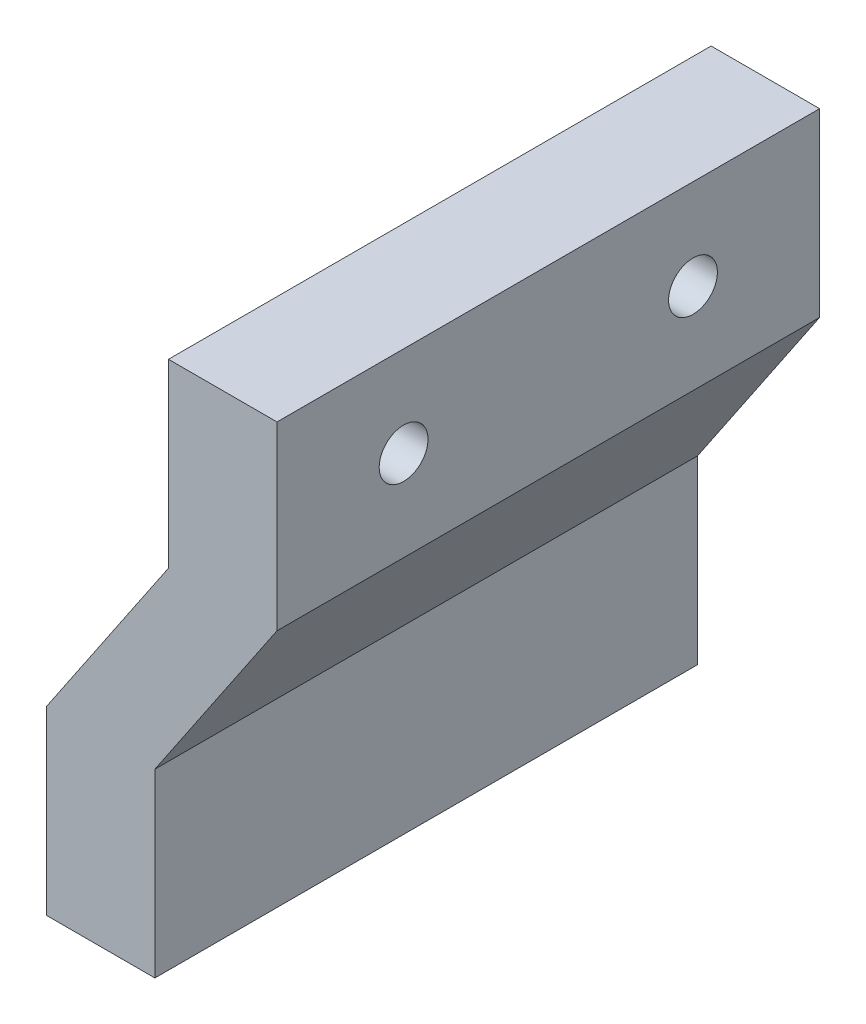
ISO-10303-21;
HEADER;
FILE_DESCRIPTION(('STEP AP214'),'2;1');
FILE_NAME('part.step','',(''),(''),'','','');
FILE_SCHEMA(('AUTOMOTIVE_DESIGN { 1 0 10303 214 1 1 1 1 }'));
ENDSEC;
DATA;
#1=APPLICATION_CONTEXT('core data for automotive mechanical design processes');
#2=APPLICATION_PROTOCOL_DEFINITION('international standard','automotive_design',2000,#1);
#3=PRODUCT_CONTEXT('',#1,'mechanical');
#4=PRODUCT('Part','Part','',(#3));
#5=PRODUCT_RELATED_PRODUCT_CATEGORY('part','',(#4));
#6=PRODUCT_DEFINITION_FORMATION('','',#4);
#7=PRODUCT_DEFINITION_CONTEXT('part definition',#1,'design');
#8=PRODUCT_DEFINITION('design','',#6,#7);
#9=PRODUCT_DEFINITION_SHAPE('','',#8);
#10=(LENGTH_UNIT() NAMED_UNIT(*) SI_UNIT(.MILLI.,.METRE.));
#11=(NAMED_UNIT(*) PLANE_ANGLE_UNIT() SI_UNIT($,.RADIAN.));
#12=(NAMED_UNIT(*) SI_UNIT($,.STERADIAN.) SOLID_ANGLE_UNIT());
#13=UNCERTAINTY_MEASURE_WITH_UNIT(LENGTH_MEASURE(1.E-05),#10,'distance_accuracy_value','');
#14=(GEOMETRIC_REPRESENTATION_CONTEXT(3) GLOBAL_UNCERTAINTY_ASSIGNED_CONTEXT((#13)) GLOBAL_UNIT_ASSIGNED_CONTEXT((#10,
#11,#12)) REPRESENTATION_CONTEXT('',''));
#15=CARTESIAN_POINT('',(0.,0.,0.));
#16=DIRECTION('',(0.,0.,1.));
#17=DIRECTION('',(1.,0.,0.));
#18=AXIS2_PLACEMENT_3D('',#15,#16,#17);
#19=CARTESIAN_POINT('',(0.,10.,30.));
#20=DIRECTION('',(1.,0.,0.));
#21=DIRECTION('',(0.,1.,0.));
#22=AXIS2_PLACEMENT_3D('',#19,#20,#21);
#23=PLANE('',#22);
#24=DIRECTION('',(0.,-1.,0.));
#25=VECTOR('',#24,1.);
#26=CARTESIAN_POINT('',(0.,10.,0.));
#27=LINE('',#26,#25);
#28=CARTESIAN_POINT('',(0.,10.,0.));
#29=VERTEX_POINT('',#28);
#30=CARTESIAN_POINT('',(0.,0.,0.));
#31=VERTEX_POINT('',#30);
#32=EDGE_CURVE('E134',#29,#31,#27,.T.);
#33=ORIENTED_EDGE('',*,*,#32,.T.);
#34=DIRECTION('',(0.,0.,-1.));
#35=VECTOR('',#34,1.);
#36=CARTESIAN_POINT('',(0.,0.,30.));
#37=LINE('',#36,#35);
#38=CARTESIAN_POINT('',(0.,0.,30.));
#39=VERTEX_POINT('',#38);
#40=EDGE_CURVE('E11',#39,#31,#37,.T.);
#41=ORIENTED_EDGE('',*,*,#40,.F.);
#42=DIRECTION('',(0.,-1.,0.));
#43=VECTOR('',#42,1.);
#44=CARTESIAN_POINT('',(0.,10.,30.));
#45=LINE('',#44,#43);
#46=CARTESIAN_POINT('',(0.,10.,30.));
#47=VERTEX_POINT('',#46);
#48=EDGE_CURVE('E149',#47,#39,#45,.T.);
#49=ORIENTED_EDGE('',*,*,#48,.F.);
#50=DIRECTION('',(0.,0.,-1.));
#51=VECTOR('',#50,1.);
#52=CARTESIAN_POINT('',(0.,10.,30.));
#53=LINE('',#52,#51);
#54=EDGE_CURVE('E130',#47,#29,#53,.T.);
#55=ORIENTED_EDGE('',*,*,#54,.T.);
#56=EDGE_LOOP('',(#33,#41,#49,#55));
#57=FACE_BOUND('',#56,.T.);
#58=ADVANCED_FACE('F38',(#57),#23,.F.);
#59=CARTESIAN_POINT('',(0.,0.,30.));
#60=DIRECTION('',(0.,1.,0.));
#61=DIRECTION('',(0.,0.,1.));
#62=AXIS2_PLACEMENT_3D('',#59,#60,#61);
#63=PLANE('',#62);
#64=CARTESIAN_POINT('',(3.,0.,26.5));
#65=DIRECTION('',(0.,-1.,0.));
#66=DIRECTION('',(0.,0.,-1.));
#67=AXIS2_PLACEMENT_3D('',#64,#65,#66);
#68=CIRCLE('',#67,1.35);
#69=CARTESIAN_POINT('',(3.,0.,25.15));
#70=VERTEX_POINT('',#69);
#71=EDGE_CURVE('E189',#70,#70,#68,.T.);
#72=ORIENTED_EDGE('',*,*,#71,.F.);
#73=EDGE_LOOP('',(#72));
#74=FACE_BOUND('',#73,.T.);
#75=CARTESIAN_POINT('',(3.,0.,3.5));
#76=DIRECTION('',(0.,-1.,0.));
#77=DIRECTION('',(0.,0.,-1.));
#78=AXIS2_PLACEMENT_3D('',#75,#76,#77);
#79=CIRCLE('',#78,1.35);
#80=CARTESIAN_POINT('',(3.,0.,2.15));
#81=VERTEX_POINT('',#80);
#82=EDGE_CURVE('E185',#81,#81,#79,.T.);
#83=ORIENTED_EDGE('',*,*,#82,.F.);
#84=EDGE_LOOP('',(#83));
#85=FACE_BOUND('',#84,.T.);
#86=DIRECTION('',(1.,0.,0.));
#87=VECTOR('',#86,1.);
#88=CARTESIAN_POINT('',(0.,0.,0.));
#89=LINE('',#88,#87);
#90=CARTESIAN_POINT('',(6.00000000000001,0.,0.));
#91=VERTEX_POINT('',#90);
#92=EDGE_CURVE('E137',#31,#91,#89,.T.);
#93=ORIENTED_EDGE('',*,*,#92,.T.);
#94=DIRECTION('',(0.,0.,-1.));
#95=VECTOR('',#94,1.);
#96=CARTESIAN_POINT('',(6.00000000000001,0.,30.));
#97=LINE('',#96,#95);
#98=CARTESIAN_POINT('',(6.00000000000001,0.,30.));
#99=VERTEX_POINT('',#98);
#100=EDGE_CURVE('E46',#99,#91,#97,.T.);
#101=ORIENTED_EDGE('',*,*,#100,.F.);
#102=DIRECTION('',(1.,0.,0.));
#103=VECTOR('',#102,1.);
#104=CARTESIAN_POINT('',(0.,0.,30.));
#105=LINE('',#104,#103);
#106=EDGE_CURVE('E97',#39,#99,#105,.T.);
#107=ORIENTED_EDGE('',*,*,#106,.F.);
#108=ORIENTED_EDGE('',*,*,#40,.T.);
#109=EDGE_LOOP('',(#93,#101,#107,#108));
#110=FACE_BOUND('',#109,.T.);
#111=ADVANCED_FACE('F233',(#74,#85,#110),#63,.F.);
#112=CARTESIAN_POINT('',(6.00000000000001,0.,30.));
#113=DIRECTION('',(-1.,0.,0.));
#114=DIRECTION('',(0.,-1.,0.));
#115=AXIS2_PLACEMENT_3D('',#112,#113,#114);
#116=PLANE('',#115);
#117=DIRECTION('',(0.,1.,0.));
#118=VECTOR('',#117,1.);
#119=CARTESIAN_POINT('',(6.00000000000001,0.,0.));
#120=LINE('',#119,#118);
#121=CARTESIAN_POINT('',(6.,10.,0.));
#122=VERTEX_POINT('',#121);
#123=EDGE_CURVE('E140',#91,#122,#120,.T.);
#124=ORIENTED_EDGE('',*,*,#123,.T.);
#125=DIRECTION('',(0.,0.,-1.));
#126=VECTOR('',#125,1.);
#127=CARTESIAN_POINT('',(6.,10.,30.));
#128=LINE('',#127,#126);
#129=CARTESIAN_POINT('',(6.,10.,30.));
#130=VERTEX_POINT('',#129);
#131=EDGE_CURVE('E156',#130,#122,#128,.T.);
#132=ORIENTED_EDGE('',*,*,#131,.F.);
#133=DIRECTION('',(0.,1.,0.));
#134=VECTOR('',#133,1.);
#135=CARTESIAN_POINT('',(6.00000000000001,0.,30.));
#136=LINE('',#135,#134);
#137=EDGE_CURVE('E164',#99,#130,#136,.T.);
#138=ORIENTED_EDGE('',*,*,#137,.F.);
#139=ORIENTED_EDGE('',*,*,#100,.T.);
#140=EDGE_LOOP('',(#124,#132,#138,#139));
#141=FACE_BOUND('',#140,.T.);
#142=ADVANCED_FACE('F162',(#141),#116,.F.);
#143=CARTESIAN_POINT('',(6.,10.,30.));
#144=DIRECTION('',(-0.828848674075648,0.559472855001063,0.));
#145=DIRECTION('',(-0.559472855001063,-0.828848674075648,0.));
#146=AXIS2_PLACEMENT_3D('',#143,#144,#145);
#147=PLANE('',#146);
#148=DIRECTION('',(0.559472855001063,0.828848674075648,0.));
#149=VECTOR('',#148,1.);
#150=CARTESIAN_POINT('',(6.,10.,0.));
#151=LINE('',#150,#149);
#152=CARTESIAN_POINT('',(12.75,20.,0.));
#153=VERTEX_POINT('',#152);
#154=EDGE_CURVE('E142',#122,#153,#151,.T.);
#155=ORIENTED_EDGE('',*,*,#154,.T.);
#156=DIRECTION('',(0.,0.,-1.));
#157=VECTOR('',#156,1.);
#158=CARTESIAN_POINT('',(12.75,20.,30.));
#159=LINE('',#158,#157);
#160=CARTESIAN_POINT('',(12.75,20.,30.));
#161=VERTEX_POINT('',#160);
#162=EDGE_CURVE('E153',#161,#153,#159,.T.);
#163=ORIENTED_EDGE('',*,*,#162,.F.);
#164=DIRECTION('',(0.559472855001063,0.828848674075648,0.));
#165=VECTOR('',#164,1.);
#166=CARTESIAN_POINT('',(6.,10.,30.));
#167=LINE('',#166,#165);
#168=EDGE_CURVE('E176',#130,#161,#167,.T.);
#169=ORIENTED_EDGE('',*,*,#168,.F.);
#170=ORIENTED_EDGE('',*,*,#131,.T.);
#171=EDGE_LOOP('',(#155,#163,#169,#170));
#172=FACE_BOUND('',#171,.T.);
#173=ADVANCED_FACE('F172',(#172),#147,.F.);
#174=CARTESIAN_POINT('',(12.75,20.,30.));
#175=DIRECTION('',(-1.,0.,0.));
#176=DIRECTION('',(0.,0.,1.));
#177=AXIS2_PLACEMENT_3D('',#174,#175,#176);
#178=PLANE('',#177);
#179=CARTESIAN_POINT('',(12.75,25.,7.));
#180=DIRECTION('',(-1.,0.,0.));
#181=DIRECTION('',(0.,0.,1.));
#182=AXIS2_PLACEMENT_3D('',#179,#180,#181);
#183=CIRCLE('',#182,1.35);
#184=CARTESIAN_POINT('',(12.75,25.,8.35));
#185=VERTEX_POINT('',#184);
#186=EDGE_CURVE('E186',#185,#185,#183,.F.);
#187=ORIENTED_EDGE('',*,*,#186,.F.);
#188=EDGE_LOOP('',(#187));
#189=FACE_BOUND('',#188,.T.);
#190=CARTESIAN_POINT('',(12.75,25.,23.));
#191=DIRECTION('',(-1.,0.,0.));
#192=DIRECTION('',(0.,0.,1.));
#193=AXIS2_PLACEMENT_3D('',#190,#191,#192);
#194=CIRCLE('',#193,1.35);
#195=CARTESIAN_POINT('',(12.75,25.,24.35));
#196=VERTEX_POINT('',#195);
#197=EDGE_CURVE('E198',#196,#196,#194,.F.);
#198=ORIENTED_EDGE('',*,*,#197,.F.);
#199=EDGE_LOOP('',(#198));
#200=FACE_BOUND('',#199,.T.);
#201=DIRECTION('',(0.,1.,0.));
#202=VECTOR('',#201,1.);
#203=CARTESIAN_POINT('',(12.75,20.,0.));
#204=LINE('',#203,#202);
#205=CARTESIAN_POINT('',(12.75,30.,0.));
#206=VERTEX_POINT('',#205);
#207=EDGE_CURVE('E144',#153,#206,#204,.T.);
#208=ORIENTED_EDGE('',*,*,#207,.T.);
#209=DIRECTION('',(0.,0.,-1.));
#210=VECTOR('',#209,1.);
#211=CARTESIAN_POINT('',(12.75,30.,30.));
#212=LINE('',#211,#210);
#213=CARTESIAN_POINT('',(12.75,30.,30.));
#214=VERTEX_POINT('',#213);
#215=EDGE_CURVE('E125',#214,#206,#212,.T.);
#216=ORIENTED_EDGE('',*,*,#215,.F.);
#217=DIRECTION('',(0.,1.,0.));
#218=VECTOR('',#217,1.);
#219=CARTESIAN_POINT('',(12.75,20.,30.));
#220=LINE('',#219,#218);
#221=EDGE_CURVE('E116',#161,#214,#220,.T.);
#222=ORIENTED_EDGE('',*,*,#221,.F.);
#223=ORIENTED_EDGE('',*,*,#162,.T.);
#224=EDGE_LOOP('',(#208,#216,#222,#223));
#225=FACE_BOUND('',#224,.T.);
#226=ADVANCED_FACE('F175',(#189,#200,#225),#178,.F.);
#227=CARTESIAN_POINT('',(12.75,30.,30.));
#228=DIRECTION('',(0.,-1.,0.));
#229=DIRECTION('',(1.,0.,0.));
#230=AXIS2_PLACEMENT_3D('',#227,#228,#229);
#231=PLANE('',#230);
#232=DIRECTION('',(-1.,0.,0.));
#233=VECTOR('',#232,1.);
#234=CARTESIAN_POINT('',(12.75,30.,0.));
#235=LINE('',#234,#233);
#236=CARTESIAN_POINT('',(6.75,30.,0.));
#237=VERTEX_POINT('',#236);
#238=EDGE_CURVE('E124',#206,#237,#235,.T.);
#239=ORIENTED_EDGE('',*,*,#238,.T.);
#240=DIRECTION('',(0.,0.,-1.));
#241=VECTOR('',#240,1.);
#242=CARTESIAN_POINT('',(6.75,30.,30.));
#243=LINE('',#242,#241);
#244=CARTESIAN_POINT('',(6.75,30.,30.));
#245=VERTEX_POINT('',#244);
#246=EDGE_CURVE('E121',#245,#237,#243,.T.);
#247=ORIENTED_EDGE('',*,*,#246,.F.);
#248=DIRECTION('',(-1.,0.,0.));
#249=VECTOR('',#248,1.);
#250=CARTESIAN_POINT('',(12.75,30.,30.));
#251=LINE('',#250,#249);
#252=EDGE_CURVE('E110',#214,#245,#251,.T.);
#253=ORIENTED_EDGE('',*,*,#252,.F.);
#254=ORIENTED_EDGE('',*,*,#215,.T.);
#255=EDGE_LOOP('',(#239,#247,#253,#254));
#256=FACE_BOUND('',#255,.T.);
#257=ADVANCED_FACE('F122',(#256),#231,.F.);
#258=CARTESIAN_POINT('',(6.75,30.,30.));
#259=DIRECTION('',(1.,0.,0.));
#260=DIRECTION('',(0.,1.,0.));
#261=AXIS2_PLACEMENT_3D('',#258,#259,#260);
#262=PLANE('',#261);
#263=CARTESIAN_POINT('',(6.75,25.,7.));
#264=DIRECTION('',(-1.,0.,0.));
#265=DIRECTION('',(0.,-1.,0.));
#266=AXIS2_PLACEMENT_3D('',#263,#264,#265);
#267=CIRCLE('',#266,1.35);
#268=CARTESIAN_POINT('',(6.75,23.65,7.));
#269=VERTEX_POINT('',#268);
#270=EDGE_CURVE('E197',#269,#269,#267,.T.);
#271=ORIENTED_EDGE('',*,*,#270,.F.);
#272=EDGE_LOOP('',(#271));
#273=FACE_BOUND('',#272,.T.);
#274=CARTESIAN_POINT('',(6.75,25.,23.));
#275=DIRECTION('',(-1.,0.,0.));
#276=DIRECTION('',(0.,-1.,0.));
#277=AXIS2_PLACEMENT_3D('',#274,#275,#276);
#278=CIRCLE('',#277,1.35);
#279=CARTESIAN_POINT('',(6.75,23.65,23.));
#280=VERTEX_POINT('',#279);
#281=EDGE_CURVE('E194',#280,#280,#278,.T.);
#282=ORIENTED_EDGE('',*,*,#281,.F.);
#283=EDGE_LOOP('',(#282));
#284=FACE_BOUND('',#283,.T.);
#285=DIRECTION('',(0.,-1.,0.));
#286=VECTOR('',#285,1.);
#287=CARTESIAN_POINT('',(6.75,30.,0.));
#288=LINE('',#287,#286);
#289=CARTESIAN_POINT('',(6.75,20.,0.));
#290=VERTEX_POINT('',#289);
#291=EDGE_CURVE('E83',#237,#290,#288,.T.);
#292=ORIENTED_EDGE('',*,*,#291,.T.);
#293=DIRECTION('',(0.,0.,-1.));
#294=VECTOR('',#293,1.);
#295=CARTESIAN_POINT('',(6.75,20.,30.));
#296=LINE('',#295,#294);
#297=CARTESIAN_POINT('',(6.75,20.,30.));
#298=VERTEX_POINT('',#297);
#299=EDGE_CURVE('E126',#298,#290,#296,.T.);
#300=ORIENTED_EDGE('',*,*,#299,.F.);
#301=DIRECTION('',(0.,-1.,0.));
#302=VECTOR('',#301,1.);
#303=CARTESIAN_POINT('',(6.75,30.,30.));
#304=LINE('',#303,#302);
#305=EDGE_CURVE('E114',#245,#298,#304,.T.);
#306=ORIENTED_EDGE('',*,*,#305,.F.);
#307=ORIENTED_EDGE('',*,*,#246,.T.);
#308=EDGE_LOOP('',(#292,#300,#306,#307));
#309=FACE_BOUND('',#308,.T.);
#310=ADVANCED_FACE('F128',(#273,#284,#309),#262,.F.);
#311=CARTESIAN_POINT('',(6.75,20.,30.));
#312=DIRECTION('',(0.828848674075648,-0.559472855001063,0.));
#313=DIRECTION('',(0.559472855001063,0.828848674075648,0.));
#314=AXIS2_PLACEMENT_3D('',#311,#312,#313);
#315=PLANE('',#314);
#316=DIRECTION('',(-0.559472855001063,-0.828848674075648,0.));
#317=VECTOR('',#316,1.);
#318=CARTESIAN_POINT('',(6.75,20.,0.));
#319=LINE('',#318,#317);
#320=EDGE_CURVE('E89',#290,#29,#319,.T.);
#321=ORIENTED_EDGE('',*,*,#320,.T.);
#322=ORIENTED_EDGE('',*,*,#54,.F.);
#323=DIRECTION('',(-0.559472855001063,-0.828848674075648,0.));
#324=VECTOR('',#323,1.);
#325=CARTESIAN_POINT('',(6.75,20.,30.));
#326=LINE('',#325,#324);
#327=EDGE_CURVE('E54',#298,#47,#326,.T.);
#328=ORIENTED_EDGE('',*,*,#327,.F.);
#329=ORIENTED_EDGE('',*,*,#299,.T.);
#330=EDGE_LOOP('',(#321,#322,#328,#329));
#331=FACE_BOUND('',#330,.T.);
#332=ADVANCED_FACE('F211',(#331),#315,.F.);
#333=CARTESIAN_POINT('',(0.,0.,30.));
#334=DIRECTION('',(0.,0.,1.));
#335=DIRECTION('',(1.,0.,0.));
#336=AXIS2_PLACEMENT_3D('',#333,#334,#335);
#337=PLANE('',#336);
#338=ORIENTED_EDGE('',*,*,#48,.T.);
#339=ORIENTED_EDGE('',*,*,#106,.T.);
#340=ORIENTED_EDGE('',*,*,#137,.T.);
#341=ORIENTED_EDGE('',*,*,#168,.T.);
#342=ORIENTED_EDGE('',*,*,#221,.T.);
#343=ORIENTED_EDGE('',*,*,#252,.T.);
#344=ORIENTED_EDGE('',*,*,#305,.T.);
#345=ORIENTED_EDGE('',*,*,#327,.T.);
#346=EDGE_LOOP('',(#338,#339,#340,#341,#342,#343,#344,#345));
#347=FACE_BOUND('',#346,.T.);
#348=ADVANCED_FACE('F112',(#347),#337,.T.);
#349=CARTESIAN_POINT('',(0.,0.,0.));
#350=DIRECTION('',(0.,0.,1.));
#351=DIRECTION('',(1.,0.,0.));
#352=AXIS2_PLACEMENT_3D('',#349,#350,#351);
#353=PLANE('',#352);
#354=ORIENTED_EDGE('',*,*,#32,.F.);
#355=ORIENTED_EDGE('',*,*,#320,.F.);
#356=ORIENTED_EDGE('',*,*,#291,.F.);
#357=ORIENTED_EDGE('',*,*,#238,.F.);
#358=ORIENTED_EDGE('',*,*,#207,.F.);
#359=ORIENTED_EDGE('',*,*,#154,.F.);
#360=ORIENTED_EDGE('',*,*,#123,.F.);
#361=ORIENTED_EDGE('',*,*,#92,.F.);
#362=EDGE_LOOP('',(#354,#355,#356,#357,#358,#359,#360,#361));
#363=FACE_BOUND('',#362,.T.);
#364=ADVANCED_FACE('F168',(#363),#353,.F.);
#365=CARTESIAN_POINT('',(3.,8.5,3.5));
#366=DIRECTION('',(0.,-1.,0.));
#367=DIRECTION('',(0.,0.,-1.));
#368=AXIS2_PLACEMENT_3D('',#365,#366,#367);
#369=CYLINDRICAL_SURFACE('',#368,1.35);
#370=CARTESIAN_POINT('',(3.,8.5,3.5));
#371=DIRECTION('',(0.,-1.,0.));
#372=DIRECTION('',(0.,0.,-1.));
#373=AXIS2_PLACEMENT_3D('',#370,#371,#372);
#374=CIRCLE('',#373,1.35);
#375=CARTESIAN_POINT('',(3.,8.5,2.15));
#376=VERTEX_POINT('',#375);
#377=EDGE_CURVE('E182',#376,#376,#374,.T.);
#378=ORIENTED_EDGE('',*,*,#377,.F.);
#379=EDGE_LOOP('',(#378));
#380=FACE_BOUND('',#379,.T.);
#381=ORIENTED_EDGE('',*,*,#82,.T.);
#382=EDGE_LOOP('',(#381));
#383=FACE_BOUND('',#382,.T.);
#384=ADVANCED_FACE('F249',(#380,#383),#369,.F.);
#385=CARTESIAN_POINT('',(3.,8.5,3.5));
#386=DIRECTION('',(0.,-1.,0.));
#387=DIRECTION('',(0.,0.,-1.));
#388=AXIS2_PLACEMENT_3D('',#385,#386,#387);
#389=PLANE('',#388);
#390=ORIENTED_EDGE('',*,*,#377,.T.);
#391=EDGE_LOOP('',(#390));
#392=FACE_BOUND('',#391,.T.);
#393=ADVANCED_FACE('F251',(#392),#389,.T.);
#394=CARTESIAN_POINT('',(3.,8.5,26.5));
#395=DIRECTION('',(0.,-1.,0.));
#396=DIRECTION('',(0.,0.,-1.));
#397=AXIS2_PLACEMENT_3D('',#394,#395,#396);
#398=CYLINDRICAL_SURFACE('',#397,1.35);
#399=CARTESIAN_POINT('',(3.,8.5,26.5));
#400=DIRECTION('',(0.,-1.,0.));
#401=DIRECTION('',(0.,0.,-1.));
#402=AXIS2_PLACEMENT_3D('',#399,#400,#401);
#403=CIRCLE('',#402,1.35);
#404=CARTESIAN_POINT('',(3.,8.5,25.15));
#405=VERTEX_POINT('',#404);
#406=EDGE_CURVE('E138',#405,#405,#403,.T.);
#407=ORIENTED_EDGE('',*,*,#406,.F.);
#408=EDGE_LOOP('',(#407));
#409=FACE_BOUND('',#408,.T.);
#410=ORIENTED_EDGE('',*,*,#71,.T.);
#411=EDGE_LOOP('',(#410));
#412=FACE_BOUND('',#411,.T.);
#413=ADVANCED_FACE('F254',(#409,#412),#398,.F.);
#414=CARTESIAN_POINT('',(3.,8.5,26.5));
#415=DIRECTION('',(0.,-1.,0.));
#416=DIRECTION('',(0.,0.,-1.));
#417=AXIS2_PLACEMENT_3D('',#414,#415,#416);
#418=PLANE('',#417);
#419=ORIENTED_EDGE('',*,*,#406,.T.);
#420=EDGE_LOOP('',(#419));
#421=FACE_BOUND('',#420,.T.);
#422=ADVANCED_FACE('F218',(#421),#418,.T.);
#423=CARTESIAN_POINT('',(12.751,25.,23.));
#424=DIRECTION('',(-1.,0.,0.));
#425=DIRECTION('',(0.,-1.,0.));
#426=AXIS2_PLACEMENT_3D('',#423,#424,#425);
#427=CYLINDRICAL_SURFACE('',#426,1.35);
#428=ORIENTED_EDGE('',*,*,#281,.T.);
#429=EDGE_LOOP('',(#428));
#430=FACE_BOUND('',#429,.T.);
#431=ORIENTED_EDGE('',*,*,#197,.T.);
#432=EDGE_LOOP('',(#431));
#433=FACE_BOUND('',#432,.T.);
#434=ADVANCED_FACE('F215',(#430,#433),#427,.F.);
#435=CARTESIAN_POINT('',(12.751,25.,7.));
#436=DIRECTION('',(-1.,0.,0.));
#437=DIRECTION('',(0.,-1.,0.));
#438=AXIS2_PLACEMENT_3D('',#435,#436,#437);
#439=CYLINDRICAL_SURFACE('',#438,1.35);
#440=ORIENTED_EDGE('',*,*,#270,.T.);
#441=EDGE_LOOP('',(#440));
#442=FACE_BOUND('',#441,.T.);
#443=ORIENTED_EDGE('',*,*,#186,.T.);
#444=EDGE_LOOP('',(#443));
#445=FACE_BOUND('',#444,.T.);
#446=ADVANCED_FACE('F206',(#442,#445),#439,.F.);
#447=CLOSED_SHELL('',(#58,#111,#142,#173,#226,#257,#310,#332,#348,#364,#384,#393,#413,#422,#434,#446));
#448=MANIFOLD_SOLID_BREP('B2',#447);
#449=ADVANCED_BREP_SHAPE_REPRESENTATION('',(#18,#448),#14);
#450=SHAPE_DEFINITION_REPRESENTATION(#9,#449);
ENDSEC;
END-ISO-10303-21;
